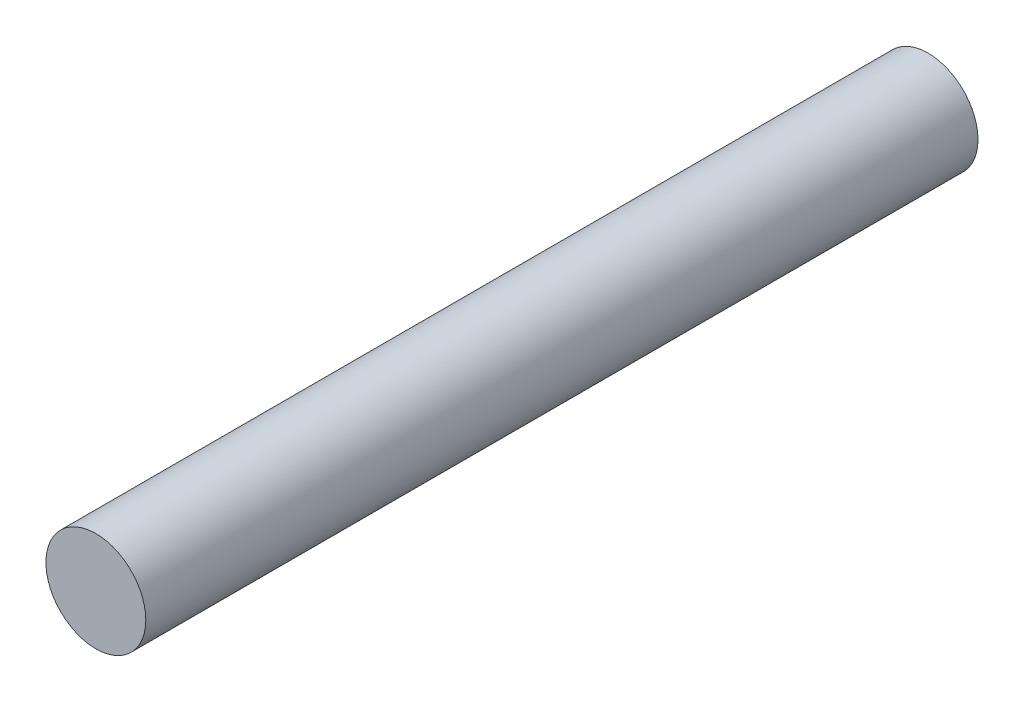
ISO-10303-21;
HEADER;
FILE_DESCRIPTION(('STEP AP214'),'2;1');
FILE_NAME('part.step','',(''),(''),'','','');
FILE_SCHEMA(('AUTOMOTIVE_DESIGN { 1 0 10303 214 1 1 1 1 }'));
ENDSEC;
DATA;
#1=APPLICATION_CONTEXT('core data for automotive mechanical design processes');
#2=APPLICATION_PROTOCOL_DEFINITION('international standard','automotive_design',2000,#1);
#3=PRODUCT_CONTEXT('',#1,'mechanical');
#4=PRODUCT('Part','Part','',(#3));
#5=PRODUCT_RELATED_PRODUCT_CATEGORY('part','',(#4));
#6=PRODUCT_DEFINITION_FORMATION('','',#4);
#7=PRODUCT_DEFINITION_CONTEXT('part definition',#1,'design');
#8=PRODUCT_DEFINITION('design','',#6,#7);
#9=PRODUCT_DEFINITION_SHAPE('','',#8);
#10=(LENGTH_UNIT() NAMED_UNIT(*) SI_UNIT(.MILLI.,.METRE.));
#11=(NAMED_UNIT(*) PLANE_ANGLE_UNIT() SI_UNIT($,.RADIAN.));
#12=(NAMED_UNIT(*) SI_UNIT($,.STERADIAN.) SOLID_ANGLE_UNIT());
#13=UNCERTAINTY_MEASURE_WITH_UNIT(LENGTH_MEASURE(1.E-05),#10,'distance_accuracy_value','');
#14=(GEOMETRIC_REPRESENTATION_CONTEXT(3) GLOBAL_UNCERTAINTY_ASSIGNED_CONTEXT((#13)) GLOBAL_UNIT_ASSIGNED_CONTEXT((#10,
#11,#12)) REPRESENTATION_CONTEXT('',''));
#15=CARTESIAN_POINT('',(0.,0.,0.));
#16=DIRECTION('',(0.,0.,1.));
#17=DIRECTION('',(1.,0.,0.));
#18=AXIS2_PLACEMENT_3D('',#15,#16,#17);
#19=CARTESIAN_POINT('',(0.,0.,25.));
#20=DIRECTION('',(0.,0.,-1.));
#21=DIRECTION('',(-1.,0.,0.));
#22=AXIS2_PLACEMENT_3D('',#19,#20,#21);
#23=CYLINDRICAL_SURFACE('',#22,1.5);
#24=CARTESIAN_POINT('',(0.,0.,25.));
#25=DIRECTION('',(0.,0.,1.));
#26=DIRECTION('',(1.,0.,0.));
#27=AXIS2_PLACEMENT_3D('',#24,#25,#26);
#28=CIRCLE('',#27,1.5);
#29=CARTESIAN_POINT('',(1.5,0.,25.));
#30=VERTEX_POINT('',#29);
#31=EDGE_CURVE('E10',#30,#30,#28,.T.);
#32=ORIENTED_EDGE('',*,*,#31,.F.);
#33=EDGE_LOOP('',(#32));
#34=FACE_BOUND('',#33,.T.);
#35=CARTESIAN_POINT('',(0.,0.,0.));
#36=DIRECTION('',(0.,0.,1.));
#37=DIRECTION('',(1.,0.,0.));
#38=AXIS2_PLACEMENT_3D('',#35,#36,#37);
#39=CIRCLE('',#38,1.5);
#40=CARTESIAN_POINT('',(1.5,0.,0.));
#41=VERTEX_POINT('',#40);
#42=EDGE_CURVE('E44',#41,#41,#39,.T.);
#43=ORIENTED_EDGE('',*,*,#42,.T.);
#44=EDGE_LOOP('',(#43));
#45=FACE_BOUND('',#44,.T.);
#46=ADVANCED_FACE('F41',(#34,#45),#23,.T.);
#47=CARTESIAN_POINT('',(0.,0.,25.));
#48=DIRECTION('',(0.,0.,1.));
#49=DIRECTION('',(1.,0.,0.));
#50=AXIS2_PLACEMENT_3D('',#47,#48,#49);
#51=PLANE('',#50);
#52=ORIENTED_EDGE('',*,*,#31,.T.);
#53=EDGE_LOOP('',(#52));
#54=FACE_BOUND('',#53,.T.);
#55=ADVANCED_FACE('F56',(#54),#51,.T.);
#56=CARTESIAN_POINT('',(0.,0.,0.));
#57=DIRECTION('',(0.,0.,1.));
#58=DIRECTION('',(1.,0.,0.));
#59=AXIS2_PLACEMENT_3D('',#56,#57,#58);
#60=PLANE('',#59);
#61=ORIENTED_EDGE('',*,*,#42,.F.);
#62=EDGE_LOOP('',(#61));
#63=FACE_BOUND('',#62,.T.);
#64=ADVANCED_FACE('F54',(#63),#60,.F.);
#65=CLOSED_SHELL('',(#46,#55,#64));
#66=MANIFOLD_SOLID_BREP('B2',#65);
#67=ADVANCED_BREP_SHAPE_REPRESENTATION('',(#18,#66),#14);
#68=SHAPE_DEFINITION_REPRESENTATION(#9,#67);
ENDSEC;
END-ISO-10303-21;
